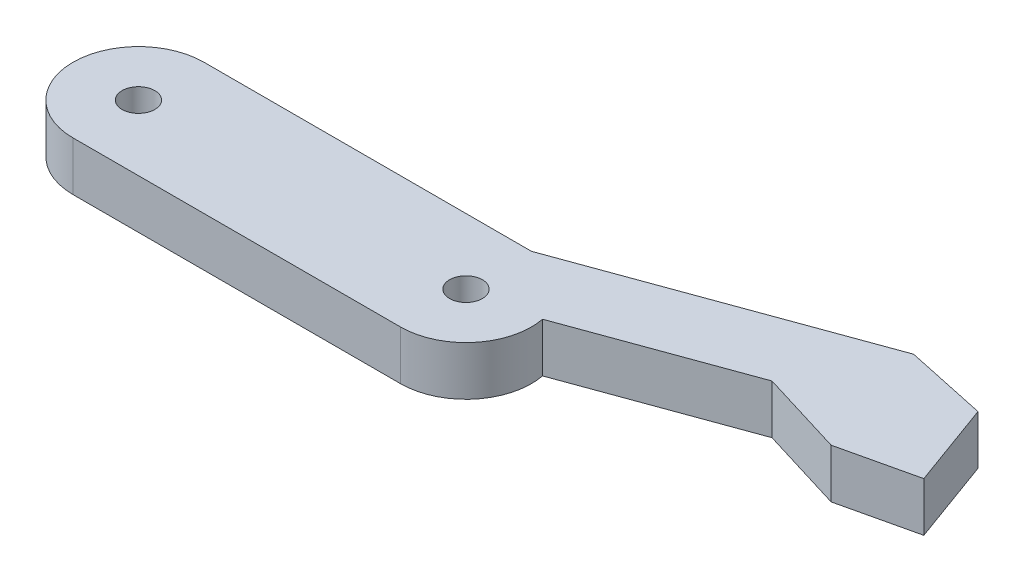
ISO-10303-21;
HEADER;
FILE_DESCRIPTION(('STEP AP214'),'2;1');
FILE_NAME('part.step','',(''),(''),'','','');
FILE_SCHEMA(('AUTOMOTIVE_DESIGN { 1 0 10303 214 1 1 1 1 }'));
ENDSEC;
DATA;
#1=APPLICATION_CONTEXT('core data for automotive mechanical design processes');
#2=APPLICATION_PROTOCOL_DEFINITION('international standard','automotive_design',2000,#1);
#3=PRODUCT_CONTEXT('',#1,'mechanical');
#4=PRODUCT('Part','Part','',(#3));
#5=PRODUCT_RELATED_PRODUCT_CATEGORY('part','',(#4));
#6=PRODUCT_DEFINITION_FORMATION('','',#4);
#7=PRODUCT_DEFINITION_CONTEXT('part definition',#1,'design');
#8=PRODUCT_DEFINITION('design','',#6,#7);
#9=PRODUCT_DEFINITION_SHAPE('','',#8);
#10=(LENGTH_UNIT() NAMED_UNIT(*) SI_UNIT(.MILLI.,.METRE.));
#11=(NAMED_UNIT(*) PLANE_ANGLE_UNIT() SI_UNIT($,.RADIAN.));
#12=(NAMED_UNIT(*) SI_UNIT($,.STERADIAN.) SOLID_ANGLE_UNIT());
#13=UNCERTAINTY_MEASURE_WITH_UNIT(LENGTH_MEASURE(1.E-05),#10,'distance_accuracy_value','');
#14=(GEOMETRIC_REPRESENTATION_CONTEXT(3) GLOBAL_UNCERTAINTY_ASSIGNED_CONTEXT((#13)) GLOBAL_UNIT_ASSIGNED_CONTEXT((#10,
#11,#12)) REPRESENTATION_CONTEXT('',''));
#15=CARTESIAN_POINT('',(0.,0.,0.));
#16=DIRECTION('',(0.,0.,1.));
#17=DIRECTION('',(1.,0.,0.));
#18=AXIS2_PLACEMENT_3D('',#15,#16,#17);
#19=CARTESIAN_POINT('',(-7.36790932574168,9.,-11.8505711357994));
#20=DIRECTION('',(0.,0.,1.));
#21=DIRECTION('',(1.,0.,0.));
#22=AXIS2_PLACEMENT_3D('',#19,#20,#21);
#23=PLANE('',#22);
#24=DIRECTION('',(-1.,0.,0.));
#25=VECTOR('',#24,1.);
#26=CARTESIAN_POINT('',(-7.36790932574168,6.,-11.8505711357994));
#27=LINE('',#26,#25);
#28=CARTESIAN_POINT('',(-7.36790932574168,6.,-11.8505711357994));
#29=VERTEX_POINT('',#28);
#30=CARTESIAN_POINT('',(-27.3679093257417,6.,-11.8505711357994));
#31=VERTEX_POINT('',#30);
#32=EDGE_CURVE('E146',#29,#31,#27,.T.);
#33=ORIENTED_EDGE('',*,*,#32,.T.);
#34=DIRECTION('',(0.,-1.,0.));
#35=VECTOR('',#34,1.);
#36=CARTESIAN_POINT('',(-27.3679093257417,9.,-11.8505711357994));
#37=LINE('',#36,#35);
#38=CARTESIAN_POINT('',(-27.3679093257417,9.,-11.8505711357994));
#39=VERTEX_POINT('',#38);
#40=EDGE_CURVE('E11',#39,#31,#37,.T.);
#41=ORIENTED_EDGE('',*,*,#40,.F.);
#42=DIRECTION('',(-1.,0.,0.));
#43=VECTOR('',#42,1.);
#44=CARTESIAN_POINT('',(-7.36790932574168,9.,-11.8505711357994));
#45=LINE('',#44,#43);
#46=CARTESIAN_POINT('',(-7.36790932574168,9.,-11.8505711357994));
#47=VERTEX_POINT('',#46);
#48=EDGE_CURVE('E173',#47,#39,#45,.T.);
#49=ORIENTED_EDGE('',*,*,#48,.F.);
#50=DIRECTION('',(0.,-1.,0.));
#51=VECTOR('',#50,1.);
#52=CARTESIAN_POINT('',(-7.36790932574168,9.,-11.8505711357994));
#53=LINE('',#52,#51);
#54=EDGE_CURVE('E53',#47,#29,#53,.T.);
#55=ORIENTED_EDGE('',*,*,#54,.T.);
#56=EDGE_LOOP('',(#33,#41,#49,#55));
#57=FACE_BOUND('',#56,.T.);
#58=ADVANCED_FACE('F37',(#57),#23,.F.);
#59=CARTESIAN_POINT('',(-27.3679093257417,9.,-7.85057113579943));
#60=DIRECTION('',(0.,-1.,0.));
#61=DIRECTION('',(0.,0.,-1.));
#62=AXIS2_PLACEMENT_3D('',#59,#60,#61);
#63=CYLINDRICAL_SURFACE('',#62,4.);
#64=CARTESIAN_POINT('',(-27.3679093257417,6.,-7.85057113579943));
#65=DIRECTION('',(0.,1.,0.));
#66=DIRECTION('',(0.,0.,1.));
#67=AXIS2_PLACEMENT_3D('',#64,#65,#66);
#68=CIRCLE('',#67,4.);
#69=CARTESIAN_POINT('',(-27.3679093257417,6.,-3.85057113579943));
#70=VERTEX_POINT('',#69);
#71=EDGE_CURVE('E148',#31,#70,#68,.T.);
#72=ORIENTED_EDGE('',*,*,#71,.T.);
#73=DIRECTION('',(0.,-1.,0.));
#74=VECTOR('',#73,1.);
#75=CARTESIAN_POINT('',(-27.3679093257417,9.,-3.85057113579943));
#76=LINE('',#75,#74);
#77=CARTESIAN_POINT('',(-27.3679093257417,9.,-3.85057113579943));
#78=VERTEX_POINT('',#77);
#79=EDGE_CURVE('E45',#78,#70,#76,.T.);
#80=ORIENTED_EDGE('',*,*,#79,.F.);
#81=CARTESIAN_POINT('',(-27.3679093257417,9.,-7.85057113579943));
#82=DIRECTION('',(0.,1.,0.));
#83=DIRECTION('',(0.,0.,1.));
#84=AXIS2_PLACEMENT_3D('',#81,#82,#83);
#85=CIRCLE('',#84,4.);
#86=EDGE_CURVE('E97',#39,#78,#85,.T.);
#87=ORIENTED_EDGE('',*,*,#86,.F.);
#88=ORIENTED_EDGE('',*,*,#40,.T.);
#89=EDGE_LOOP('',(#72,#80,#87,#88));
#90=FACE_BOUND('',#89,.T.);
#91=ADVANCED_FACE('F190',(#90),#63,.T.);
#92=CARTESIAN_POINT('',(-7.36790932574168,9.,-3.85057113579943));
#93=DIRECTION('',(0.,0.,1.));
#94=DIRECTION('',(1.,0.,0.));
#95=AXIS2_PLACEMENT_3D('',#92,#93,#94);
#96=PLANE('',#95);
#97=DIRECTION('',(-1.,0.,0.));
#98=VECTOR('',#97,1.);
#99=CARTESIAN_POINT('',(-7.36790932574168,6.,-3.85057113579943));
#100=LINE('',#99,#98);
#101=CARTESIAN_POINT('',(-7.36790932574168,6.,-3.85057113579943));
#102=VERTEX_POINT('',#101);
#103=EDGE_CURVE('E152',#102,#70,#100,.T.);
#104=ORIENTED_EDGE('',*,*,#103,.F.);
#105=DIRECTION('',(0.,-1.,0.));
#106=VECTOR('',#105,1.);
#107=CARTESIAN_POINT('',(-7.36790932574168,9.,-3.85057113579943));
#108=LINE('',#107,#106);
#109=CARTESIAN_POINT('',(-7.36790932574168,9.,-3.85057113579943));
#110=VERTEX_POINT('',#109);
#111=EDGE_CURVE('E183',#110,#102,#108,.T.);
#112=ORIENTED_EDGE('',*,*,#111,.F.);
#113=DIRECTION('',(-1.,0.,0.));
#114=VECTOR('',#113,1.);
#115=CARTESIAN_POINT('',(-7.36790932574168,9.,-3.85057113579943));
#116=LINE('',#115,#114);
#117=EDGE_CURVE('E189',#110,#78,#116,.T.);
#118=ORIENTED_EDGE('',*,*,#117,.T.);
#119=ORIENTED_EDGE('',*,*,#79,.T.);
#120=EDGE_LOOP('',(#104,#112,#118,#119));
#121=FACE_BOUND('',#120,.T.);
#122=ADVANCED_FACE('F187',(#121),#96,.T.);
#123=CARTESIAN_POINT('',(-7.36790932574168,9.,-7.85057113579943));
#124=DIRECTION('',(0.,-1.,0.));
#125=DIRECTION('',(0.,0.,-1.));
#126=AXIS2_PLACEMENT_3D('',#123,#124,#125);
#127=CYLINDRICAL_SURFACE('',#126,4.);
#128=CARTESIAN_POINT('',(-7.36790932574168,6.,-7.85057113579943));
#129=DIRECTION('',(0.,1.,0.));
#130=DIRECTION('',(0.,0.,1.));
#131=AXIS2_PLACEMENT_3D('',#128,#129,#130);
#132=CIRCLE('',#131,4.);
#133=CARTESIAN_POINT('',(-3.43843707367427,6.,-8.59839987303295));
#134=VERTEX_POINT('',#133);
#135=EDGE_CURVE('E155',#102,#134,#132,.T.);
#136=ORIENTED_EDGE('',*,*,#135,.T.);
#137=DIRECTION('',(0.,-1.,0.));
#138=VECTOR('',#137,1.);
#139=CARTESIAN_POINT('',(-3.43843707367427,9.,-8.59839987303295));
#140=LINE('',#139,#138);
#141=CARTESIAN_POINT('',(-3.43843707367427,9.,-8.59839987303295));
#142=VERTEX_POINT('',#141);
#143=EDGE_CURVE('E181',#142,#134,#140,.T.);
#144=ORIENTED_EDGE('',*,*,#143,.F.);
#145=CARTESIAN_POINT('',(-7.36790932574168,9.,-7.85057113579943));
#146=DIRECTION('',(0.,1.,0.));
#147=DIRECTION('',(0.,0.,1.));
#148=AXIS2_PLACEMENT_3D('',#145,#146,#147);
#149=CIRCLE('',#148,4.);
#150=EDGE_CURVE('E201',#110,#142,#149,.T.);
#151=ORIENTED_EDGE('',*,*,#150,.F.);
#152=ORIENTED_EDGE('',*,*,#111,.T.);
#153=EDGE_LOOP('',(#136,#144,#151,#152));
#154=FACE_BOUND('',#153,.T.);
#155=ADVANCED_FACE('F198',(#154),#127,.T.);
#156=CARTESIAN_POINT('',(-7.14859591448181,9.,-7.24801249057939));
#157=DIRECTION('',(0.342020143325673,0.,0.939692620785907));
#158=DIRECTION('',(0.939692620785907,0.,-0.342020143325673));
#159=AXIS2_PLACEMENT_3D('',#156,#157,#158);
#160=PLANE('',#159);
#161=DIRECTION('',(-0.939692620785907,0.,0.342020143325673));
#162=VECTOR('',#161,1.);
#163=CARTESIAN_POINT('',(-7.14859591448181,6.,-7.24801249057939));
#164=LINE('',#163,#162);
#165=CARTESIAN_POINT('',(6.83209067425833,6.,-12.3365662634856));
#166=VERTEX_POINT('',#165);
#167=EDGE_CURVE('E158',#166,#134,#164,.T.);
#168=ORIENTED_EDGE('',*,*,#167,.F.);
#169=DIRECTION('',(0.,-1.,0.));
#170=VECTOR('',#169,1.);
#171=CARTESIAN_POINT('',(6.83209067425833,9.,-12.3365662634856));
#172=LINE('',#171,#170);
#173=CARTESIAN_POINT('',(6.83209067425833,9.,-12.3365662634856));
#174=VERTEX_POINT('',#173);
#175=EDGE_CURVE('E179',#174,#166,#172,.T.);
#176=ORIENTED_EDGE('',*,*,#175,.F.);
#177=DIRECTION('',(-0.939692620785907,0.,0.342020143325673));
#178=VECTOR('',#177,1.);
#179=CARTESIAN_POINT('',(-7.14859591448181,9.,-7.24801249057939));
#180=LINE('',#179,#178);
#181=EDGE_CURVE('E203',#174,#142,#180,.T.);
#182=ORIENTED_EDGE('',*,*,#181,.T.);
#183=ORIENTED_EDGE('',*,*,#143,.T.);
#184=EDGE_LOOP('',(#168,#176,#182,#183));
#185=FACE_BOUND('',#184,.T.);
#186=ADVANCED_FACE('F306',(#185),#160,.T.);
#187=CARTESIAN_POINT('',(-4.89980777067921,9.,-15.9233675698602));
#188=DIRECTION('',(-0.292371704722741,0.,0.956304755963034));
#189=DIRECTION('',(0.956304755963034,0.,0.292371704722741));
#190=AXIS2_PLACEMENT_3D('',#187,#188,#189);
#191=PLANE('',#190);
#192=DIRECTION('',(-0.956304755963034,0.,-0.292371704722741));
#193=VECTOR('',#192,1.);
#194=CARTESIAN_POINT('',(-4.89980777067921,6.,-15.9233675698602));
#195=LINE('',#194,#193);
#196=CARTESIAN_POINT('',(12.0320906742583,6.,-10.7467667199005));
#197=VERTEX_POINT('',#196);
#198=EDGE_CURVE('E161',#197,#166,#195,.T.);
#199=ORIENTED_EDGE('',*,*,#198,.F.);
#200=DIRECTION('',(0.,-1.,0.));
#201=VECTOR('',#200,1.);
#202=CARTESIAN_POINT('',(12.0320906742583,9.,-10.7467667199005));
#203=LINE('',#202,#201);
#204=CARTESIAN_POINT('',(12.0320906742583,9.,-10.7467667199005));
#205=VERTEX_POINT('',#204);
#206=EDGE_CURVE('E177',#205,#197,#203,.T.);
#207=ORIENTED_EDGE('',*,*,#206,.F.);
#208=DIRECTION('',(-0.956304755963034,0.,-0.292371704722741));
#209=VECTOR('',#208,1.);
#210=CARTESIAN_POINT('',(-4.89980777067921,9.,-15.9233675698602));
#211=LINE('',#210,#209);
#212=EDGE_CURVE('E210',#205,#174,#211,.T.);
#213=ORIENTED_EDGE('',*,*,#212,.T.);
#214=ORIENTED_EDGE('',*,*,#175,.T.);
#215=EDGE_LOOP('',(#199,#207,#213,#214));
#216=FACE_BOUND('',#215,.T.);
#217=ADVANCED_FACE('F297',(#216),#191,.T.);
#218=CARTESIAN_POINT('',(-7.02101586460754,9.,-6.34801047794996));
#219=DIRECTION('',(0.224951054343862,0.,0.974370064785236));
#220=DIRECTION('',(0.974370064785236,0.,-0.224951054343862));
#221=AXIS2_PLACEMENT_3D('',#218,#219,#220);
#222=PLANE('',#221);
#223=DIRECTION('',(-0.974370064785236,0.,0.224951054343862));
#224=VECTOR('',#223,1.);
#225=CARTESIAN_POINT('',(-7.02101586460754,6.,-6.34801047794996));
#226=LINE('',#225,#224);
#227=CARTESIAN_POINT('',(16.6320906742583,6.,-11.8087603990781));
#228=VERTEX_POINT('',#227);
#229=EDGE_CURVE('E164',#228,#197,#226,.T.);
#230=ORIENTED_EDGE('',*,*,#229,.F.);
#231=DIRECTION('',(0.,-1.,0.));
#232=VECTOR('',#231,1.);
#233=CARTESIAN_POINT('',(16.6320906742583,9.,-11.8087603990781));
#234=LINE('',#233,#232);
#235=CARTESIAN_POINT('',(16.6320906742583,9.,-11.8087603990781));
#236=VERTEX_POINT('',#235);
#237=EDGE_CURVE('E128',#236,#228,#234,.T.);
#238=ORIENTED_EDGE('',*,*,#237,.F.);
#239=DIRECTION('',(-0.974370064785236,0.,0.224951054343862));
#240=VECTOR('',#239,1.);
#241=CARTESIAN_POINT('',(-7.02101586460754,9.,-6.34801047794996));
#242=LINE('',#241,#240);
#243=EDGE_CURVE('E138',#236,#205,#242,.T.);
#244=ORIENTED_EDGE('',*,*,#243,.T.);
#245=ORIENTED_EDGE('',*,*,#206,.T.);
#246=EDGE_LOOP('',(#230,#238,#244,#245));
#247=FACE_BOUND('',#246,.T.);
#248=ADVANCED_FACE('F214',(#247),#222,.T.);
#249=CARTESIAN_POINT('',(15.0967614993009,9.,-16.0270426387034));
#250=DIRECTION('',(0.939692620785907,0.,-0.342020143325674));
#251=DIRECTION('',(-0.342020143325674,0.,-0.939692620785907));
#252=AXIS2_PLACEMENT_3D('',#249,#250,#251);
#253=PLANE('',#252);
#254=DIRECTION('',(0.342020143325674,0.,0.939692620785907));
#255=VECTOR('',#254,1.);
#256=CARTESIAN_POINT('',(15.0967614993009,6.,-16.0270426387034));
#257=LINE('',#256,#255);
#258=CARTESIAN_POINT('',(14.739445456074,6.,-17.0087603990781));
#259=VERTEX_POINT('',#258);
#260=EDGE_CURVE('E124',#259,#228,#257,.T.);
#261=ORIENTED_EDGE('',*,*,#260,.F.);
#262=DIRECTION('',(0.,-1.,0.));
#263=VECTOR('',#262,1.);
#264=CARTESIAN_POINT('',(14.739445456074,9.,-17.0087603990781));
#265=LINE('',#264,#263);
#266=CARTESIAN_POINT('',(14.739445456074,9.,-17.0087603990781));
#267=VERTEX_POINT('',#266);
#268=EDGE_CURVE('E119',#267,#259,#265,.T.);
#269=ORIENTED_EDGE('',*,*,#268,.F.);
#270=DIRECTION('',(0.342020143325674,0.,0.939692620785907));
#271=VECTOR('',#270,1.);
#272=CARTESIAN_POINT('',(15.0967614993009,9.,-16.0270426387034));
#273=LINE('',#272,#271);
#274=EDGE_CURVE('E122',#267,#236,#273,.T.);
#275=ORIENTED_EDGE('',*,*,#274,.T.);
#276=ORIENTED_EDGE('',*,*,#237,.T.);
#277=EDGE_LOOP('',(#261,#269,#275,#276));
#278=FACE_BOUND('',#277,.T.);
#279=ADVANCED_FACE('F121',(#278),#253,.T.);
#280=CARTESIAN_POINT('',(-4.53118137037541,9.,-21.1264257090221));
#281=DIRECTION('',(0.208958725835199,0.,-0.977924460731671));
#282=DIRECTION('',(-0.977924460731671,0.,-0.2089587258352));
#283=AXIS2_PLACEMENT_3D('',#280,#281,#282);
#284=PLANE('',#283);
#285=DIRECTION('',(0.977924460731671,0.,0.2089587258352));
#286=VECTOR('',#285,1.);
#287=CARTESIAN_POINT('',(-4.53118137037541,6.,-21.1264257090221));
#288=LINE('',#287,#286);
#289=CARTESIAN_POINT('',(9.73944545607405,6.,-18.077139063412));
#290=VERTEX_POINT('',#289);
#291=EDGE_CURVE('E168',#290,#259,#288,.T.);
#292=ORIENTED_EDGE('',*,*,#291,.F.);
#293=DIRECTION('',(0.,-1.,0.));
#294=VECTOR('',#293,1.);
#295=CARTESIAN_POINT('',(9.73944545607405,9.,-18.077139063412));
#296=LINE('',#295,#294);
#297=CARTESIAN_POINT('',(9.73944545607405,9.,-18.077139063412));
#298=VERTEX_POINT('',#297);
#299=EDGE_CURVE('E85',#298,#290,#296,.T.);
#300=ORIENTED_EDGE('',*,*,#299,.F.);
#301=DIRECTION('',(0.977924460731671,0.,0.2089587258352));
#302=VECTOR('',#301,1.);
#303=CARTESIAN_POINT('',(-4.53118137037541,9.,-21.1264257090221));
#304=LINE('',#303,#302);
#305=EDGE_CURVE('E135',#298,#267,#304,.T.);
#306=ORIENTED_EDGE('',*,*,#305,.T.);
#307=ORIENTED_EDGE('',*,*,#268,.T.);
#308=EDGE_LOOP('',(#292,#300,#306,#307));
#309=FACE_BOUND('',#308,.T.);
#310=ADVANCED_FACE('F140',(#309),#284,.T.);
#311=CARTESIAN_POINT('',(-8.65348454511477,9.,-11.3826600220374));
#312=DIRECTION('',(-0.342020143325673,0.,-0.939692620785907));
#313=DIRECTION('',(-0.939692620785907,0.,0.342020143325673));
#314=AXIS2_PLACEMENT_3D('',#311,#312,#313);
#315=PLANE('',#314);
#316=DIRECTION('',(0.939692620785907,0.,-0.342020143325673));
#317=VECTOR('',#316,1.);
#318=CARTESIAN_POINT('',(-8.65348454511477,6.,-11.3826600220374));
#319=LINE('',#318,#317);
#320=EDGE_CURVE('E170',#29,#290,#319,.T.);
#321=ORIENTED_EDGE('',*,*,#320,.F.);
#322=ORIENTED_EDGE('',*,*,#54,.F.);
#323=DIRECTION('',(0.939692620785907,0.,-0.342020143325673));
#324=VECTOR('',#323,1.);
#325=CARTESIAN_POINT('',(-8.65348454511477,9.,-11.3826600220374));
#326=LINE('',#325,#324);
#327=EDGE_CURVE('E141',#47,#298,#326,.T.);
#328=ORIENTED_EDGE('',*,*,#327,.T.);
#329=ORIENTED_EDGE('',*,*,#299,.T.);
#330=EDGE_LOOP('',(#321,#322,#328,#329));
#331=FACE_BOUND('',#330,.T.);
#332=ADVANCED_FACE('F216',(#331),#315,.T.);
#333=CARTESIAN_POINT('',(-7.36790932574168,9.,-7.85057113579943));
#334=DIRECTION('',(0.,1.,0.));
#335=DIRECTION('',(0.,0.,1.));
#336=AXIS2_PLACEMENT_3D('',#333,#334,#335);
#337=PLANE('',#336);
#338=CARTESIAN_POINT('',(-27.3679093257417,9.,-7.85057113579943));
#339=DIRECTION('',(0.,1.,0.));
#340=DIRECTION('',(0.,0.,1.));
#341=AXIS2_PLACEMENT_3D('',#338,#339,#340);
#342=CIRCLE('',#341,0.999999999999998);
#343=CARTESIAN_POINT('',(-27.3679093257417,9.,-6.85057113579943));
#344=VERTEX_POINT('',#343);
#345=EDGE_CURVE('E240',#344,#344,#342,.T.);
#346=ORIENTED_EDGE('',*,*,#345,.F.);
#347=EDGE_LOOP('',(#346));
#348=FACE_BOUND('',#347,.T.);
#349=CARTESIAN_POINT('',(-7.36790932574168,9.,-7.85057113579943));
#350=DIRECTION('',(0.,1.,0.));
#351=DIRECTION('',(0.,0.,1.));
#352=AXIS2_PLACEMENT_3D('',#349,#350,#351);
#353=CIRCLE('',#352,0.999999999999998);
#354=CARTESIAN_POINT('',(-7.36790932574168,9.,-6.85057113579944));
#355=VERTEX_POINT('',#354);
#356=EDGE_CURVE('E234',#355,#355,#353,.T.);
#357=ORIENTED_EDGE('',*,*,#356,.F.);
#358=EDGE_LOOP('',(#357));
#359=FACE_BOUND('',#358,.T.);
#360=ORIENTED_EDGE('',*,*,#48,.T.);
#361=ORIENTED_EDGE('',*,*,#86,.T.);
#362=ORIENTED_EDGE('',*,*,#117,.F.);
#363=ORIENTED_EDGE('',*,*,#150,.T.);
#364=ORIENTED_EDGE('',*,*,#181,.F.);
#365=ORIENTED_EDGE('',*,*,#212,.F.);
#366=ORIENTED_EDGE('',*,*,#243,.F.);
#367=ORIENTED_EDGE('',*,*,#274,.F.);
#368=ORIENTED_EDGE('',*,*,#305,.F.);
#369=ORIENTED_EDGE('',*,*,#327,.F.);
#370=EDGE_LOOP('',(#360,#361,#362,#363,#364,#365,#366,#367,#368,#369));
#371=FACE_BOUND('',#370,.T.);
#372=ADVANCED_FACE('F133',(#348,#359,#371),#337,.T.);
#373=CARTESIAN_POINT('',(-7.36790932574168,6.,-7.85057113579943));
#374=DIRECTION('',(0.,1.,0.));
#375=DIRECTION('',(0.,0.,1.));
#376=AXIS2_PLACEMENT_3D('',#373,#374,#375);
#377=PLANE('',#376);
#378=CARTESIAN_POINT('',(-27.3679093257417,6.,-7.85057113579943));
#379=DIRECTION('',(0.,1.,0.));
#380=DIRECTION('',(0.,0.,1.));
#381=AXIS2_PLACEMENT_3D('',#378,#379,#380);
#382=CIRCLE('',#381,0.999999999999998);
#383=CARTESIAN_POINT('',(-27.3679093257417,6.,-6.85057113579943));
#384=VERTEX_POINT('',#383);
#385=EDGE_CURVE('E237',#384,#384,#382,.T.);
#386=ORIENTED_EDGE('',*,*,#385,.T.);
#387=EDGE_LOOP('',(#386));
#388=FACE_BOUND('',#387,.T.);
#389=CARTESIAN_POINT('',(-7.36790932574168,6.,-7.85057113579943));
#390=DIRECTION('',(0.,1.,0.));
#391=DIRECTION('',(0.,0.,1.));
#392=AXIS2_PLACEMENT_3D('',#389,#390,#391);
#393=CIRCLE('',#392,0.999999999999999);
#394=CARTESIAN_POINT('',(-7.36790932574168,6.,-6.85057113579943));
#395=VERTEX_POINT('',#394);
#396=EDGE_CURVE('E149',#395,#395,#393,.T.);
#397=ORIENTED_EDGE('',*,*,#396,.T.);
#398=EDGE_LOOP('',(#397));
#399=FACE_BOUND('',#398,.T.);
#400=ORIENTED_EDGE('',*,*,#32,.F.);
#401=ORIENTED_EDGE('',*,*,#320,.T.);
#402=ORIENTED_EDGE('',*,*,#291,.T.);
#403=ORIENTED_EDGE('',*,*,#260,.T.);
#404=ORIENTED_EDGE('',*,*,#229,.T.);
#405=ORIENTED_EDGE('',*,*,#198,.T.);
#406=ORIENTED_EDGE('',*,*,#167,.T.);
#407=ORIENTED_EDGE('',*,*,#135,.F.);
#408=ORIENTED_EDGE('',*,*,#103,.T.);
#409=ORIENTED_EDGE('',*,*,#71,.F.);
#410=EDGE_LOOP('',(#400,#401,#402,#403,#404,#405,#406,#407,#408,#409));
#411=FACE_BOUND('',#410,.T.);
#412=ADVANCED_FACE('F194',(#388,#399,#411),#377,.F.);
#413=CARTESIAN_POINT('',(-7.36790932574168,9.,-7.85057113579943));
#414=DIRECTION('',(0.,1.,0.));
#415=DIRECTION('',(0.,0.,1.));
#416=AXIS2_PLACEMENT_3D('',#413,#414,#415);
#417=CYLINDRICAL_SURFACE('',#416,0.999999999999999);
#418=ORIENTED_EDGE('',*,*,#396,.F.);
#419=EDGE_LOOP('',(#418));
#420=FACE_BOUND('',#419,.T.);
#421=ORIENTED_EDGE('',*,*,#356,.T.);
#422=EDGE_LOOP('',(#421));
#423=FACE_BOUND('',#422,.T.);
#424=ADVANCED_FACE('F248',(#420,#423),#417,.F.);
#425=CARTESIAN_POINT('',(-27.3679093257417,9.,-7.85057113579943));
#426=DIRECTION('',(0.,1.,0.));
#427=DIRECTION('',(0.,0.,1.));
#428=AXIS2_PLACEMENT_3D('',#425,#426,#427);
#429=CYLINDRICAL_SURFACE('',#428,0.999999999999998);
#430=ORIENTED_EDGE('',*,*,#385,.F.);
#431=EDGE_LOOP('',(#430));
#432=FACE_BOUND('',#431,.T.);
#433=ORIENTED_EDGE('',*,*,#345,.T.);
#434=EDGE_LOOP('',(#433));
#435=FACE_BOUND('',#434,.T.);
#436=ADVANCED_FACE('F244',(#432,#435),#429,.F.);
#437=CLOSED_SHELL('',(#58,#91,#122,#155,#186,#217,#248,#279,#310,#332,#372,#412,#424,#436));
#438=MANIFOLD_SOLID_BREP('B2',#437);
#439=ADVANCED_BREP_SHAPE_REPRESENTATION('',(#18,#438),#14);
#440=SHAPE_DEFINITION_REPRESENTATION(#9,#439);
ENDSEC;
END-ISO-10303-21;
